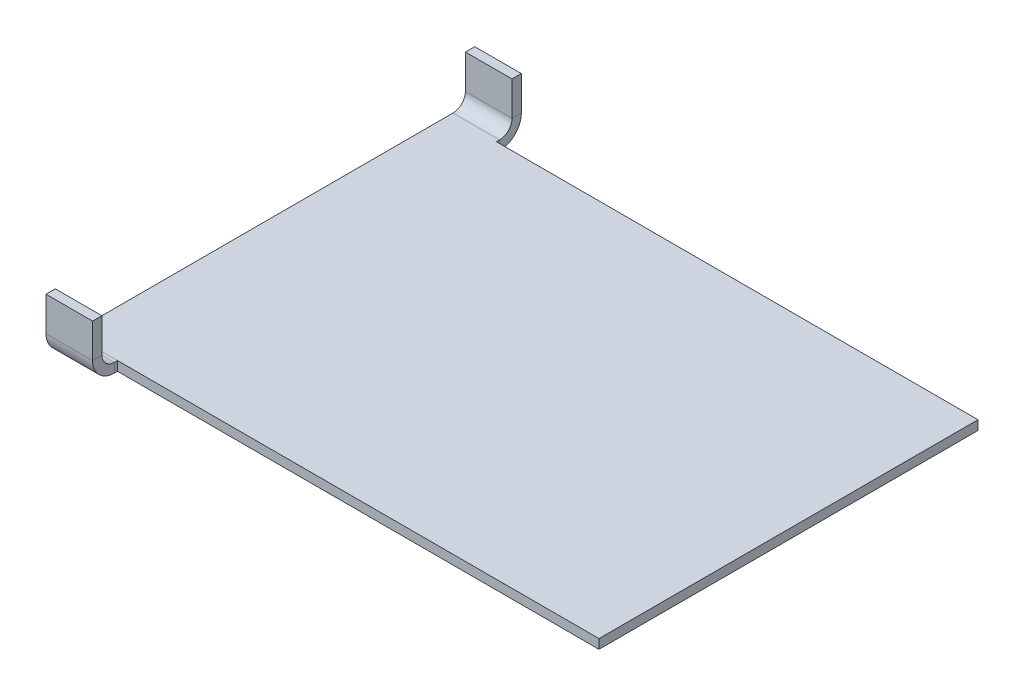
ISO-10303-21;
HEADER;
FILE_DESCRIPTION(('STEP AP214'),'2;1');
FILE_NAME('part.step','',(''),(''),'','','');
FILE_SCHEMA(('AUTOMOTIVE_DESIGN { 1 0 10303 214 1 1 1 1 }'));
ENDSEC;
DATA;
#1=APPLICATION_CONTEXT('core data for automotive mechanical design processes');
#2=APPLICATION_PROTOCOL_DEFINITION('international standard','automotive_design',2000,#1);
#3=PRODUCT_CONTEXT('',#1,'mechanical');
#4=PRODUCT('Part','Part','',(#3));
#5=PRODUCT_RELATED_PRODUCT_CATEGORY('part','',(#4));
#6=PRODUCT_DEFINITION_FORMATION('','',#4);
#7=PRODUCT_DEFINITION_CONTEXT('part definition',#1,'design');
#8=PRODUCT_DEFINITION('design','',#6,#7);
#9=PRODUCT_DEFINITION_SHAPE('','',#8);
#10=(LENGTH_UNIT() NAMED_UNIT(*) SI_UNIT(.MILLI.,.METRE.));
#11=(NAMED_UNIT(*) PLANE_ANGLE_UNIT() SI_UNIT($,.RADIAN.));
#12=(NAMED_UNIT(*) SI_UNIT($,.STERADIAN.) SOLID_ANGLE_UNIT());
#13=UNCERTAINTY_MEASURE_WITH_UNIT(LENGTH_MEASURE(1.E-05),#10,'distance_accuracy_value','');
#14=(GEOMETRIC_REPRESENTATION_CONTEXT(3) GLOBAL_UNCERTAINTY_ASSIGNED_CONTEXT((#13)) GLOBAL_UNIT_ASSIGNED_CONTEXT((#10,
#11,#12)) REPRESENTATION_CONTEXT('',''));
#15=CARTESIAN_POINT('',(0.,0.,0.));
#16=DIRECTION('',(0.,0.,1.));
#17=DIRECTION('',(1.,0.,0.));
#18=AXIS2_PLACEMENT_3D('',#15,#16,#17);
#19=CARTESIAN_POINT('',(15.,0.,123.));
#20=DIRECTION('',(1.,0.,0.));
#21=DIRECTION('',(0.,0.,-1.));
#22=AXIS2_PLACEMENT_3D('',#19,#20,#21);
#23=PLANE('',#22);
#24=DIRECTION('',(0.,-1.,0.));
#25=VECTOR('',#24,1.);
#26=CARTESIAN_POINT('',(15.,0.,123.));
#27=LINE('',#26,#25);
#28=CARTESIAN_POINT('',(15.,0.,123.));
#29=VERTEX_POINT('',#28);
#30=CARTESIAN_POINT('',(15.,-3.,123.));
#31=VERTEX_POINT('',#30);
#32=EDGE_CURVE('E12',#29,#31,#27,.T.);
#33=ORIENTED_EDGE('',*,*,#32,.F.);
#34=CARTESIAN_POINT('',(15.,4.,123.));
#35=DIRECTION('',(1.,0.,0.));
#36=DIRECTION('',(0.,0.,-1.));
#37=AXIS2_PLACEMENT_3D('',#34,#35,#36);
#38=CIRCLE('',#37,4.);
#39=CARTESIAN_POINT('',(15.,4.,127.));
#40=VERTEX_POINT('',#39);
#41=EDGE_CURVE('E193',#29,#40,#38,.F.);
#42=ORIENTED_EDGE('',*,*,#41,.T.);
#43=DIRECTION('',(0.,0.,-1.));
#44=VECTOR('',#43,1.);
#45=CARTESIAN_POINT('',(15.,4.,130.));
#46=LINE('',#45,#44);
#47=CARTESIAN_POINT('',(15.,4.,130.));
#48=VERTEX_POINT('',#47);
#49=EDGE_CURVE('E57',#48,#40,#46,.T.);
#50=ORIENTED_EDGE('',*,*,#49,.F.);
#51=CARTESIAN_POINT('',(15.,4.,123.));
#52=DIRECTION('',(-1.,0.,0.));
#53=DIRECTION('',(0.,0.,1.));
#54=AXIS2_PLACEMENT_3D('',#51,#52,#53);
#55=CIRCLE('',#54,7.);
#56=EDGE_CURVE('E146',#31,#48,#55,.T.);
#57=ORIENTED_EDGE('',*,*,#56,.F.);
#58=EDGE_LOOP('',(#33,#42,#50,#57));
#59=FACE_BOUND('',#58,.T.);
#60=ADVANCED_FACE('F49',(#59),#23,.T.);
#61=CARTESIAN_POINT('',(15.,4.,130.));
#62=DIRECTION('',(1.,0.,0.));
#63=DIRECTION('',(0.,0.,-1.));
#64=AXIS2_PLACEMENT_3D('',#61,#62,#63);
#65=PLANE('',#64);
#66=DIRECTION('',(0.,0.,1.));
#67=VECTOR('',#66,1.);
#68=CARTESIAN_POINT('',(15.,0.,122.));
#69=LINE('',#68,#67);
#70=CARTESIAN_POINT('',(15.,0.,122.));
#71=VERTEX_POINT('',#70);
#72=EDGE_CURVE('E142',#71,#29,#69,.T.);
#73=ORIENTED_EDGE('',*,*,#72,.T.);
#74=ORIENTED_EDGE('',*,*,#32,.T.);
#75=DIRECTION('',(0.,0.,1.));
#76=VECTOR('',#75,1.);
#77=CARTESIAN_POINT('',(15.,-3.,122.));
#78=LINE('',#77,#76);
#79=CARTESIAN_POINT('',(15.,-3.,122.));
#80=VERTEX_POINT('',#79);
#81=EDGE_CURVE('E127',#80,#31,#78,.T.);
#82=ORIENTED_EDGE('',*,*,#81,.F.);
#83=DIRECTION('',(0.,1.,0.));
#84=VECTOR('',#83,1.);
#85=CARTESIAN_POINT('',(15.,-3.,122.));
#86=LINE('',#85,#84);
#87=EDGE_CURVE('E136',#80,#71,#86,.T.);
#88=ORIENTED_EDGE('',*,*,#87,.T.);
#89=EDGE_LOOP('',(#73,#74,#82,#88));
#90=FACE_BOUND('',#89,.T.);
#91=ADVANCED_FACE('F144',(#90),#65,.T.);
#92=CARTESIAN_POINT('',(0.,4.,127.));
#93=DIRECTION('',(-1.,0.,0.));
#94=DIRECTION('',(0.,0.,1.));
#95=AXIS2_PLACEMENT_3D('',#92,#93,#94);
#96=PLANE('',#95);
#97=DIRECTION('',(0.,0.,1.));
#98=VECTOR('',#97,1.);
#99=CARTESIAN_POINT('',(0.,4.,127.));
#100=LINE('',#99,#98);
#101=CARTESIAN_POINT('',(0.,4.,127.));
#102=VERTEX_POINT('',#101);
#103=CARTESIAN_POINT('',(0.,4.,130.));
#104=VERTEX_POINT('',#103);
#105=EDGE_CURVE('E99',#102,#104,#100,.T.);
#106=ORIENTED_EDGE('',*,*,#105,.F.);
#107=CARTESIAN_POINT('',(0.,4.,123.));
#108=DIRECTION('',(1.,0.,0.));
#109=DIRECTION('',(0.,0.,-1.));
#110=AXIS2_PLACEMENT_3D('',#107,#108,#109);
#111=CIRCLE('',#110,4.);
#112=CARTESIAN_POINT('',(0.,0.,123.));
#113=VERTEX_POINT('',#112);
#114=EDGE_CURVE('E160',#113,#102,#111,.F.);
#115=ORIENTED_EDGE('',*,*,#114,.F.);
#116=DIRECTION('',(0.,1.,0.));
#117=VECTOR('',#116,1.);
#118=CARTESIAN_POINT('',(0.,-3.,123.));
#119=LINE('',#118,#117);
#120=CARTESIAN_POINT('',(0.,-3.,123.));
#121=VERTEX_POINT('',#120);
#122=EDGE_CURVE('E92',#121,#113,#119,.T.);
#123=ORIENTED_EDGE('',*,*,#122,.F.);
#124=CARTESIAN_POINT('',(0.,4.,123.));
#125=DIRECTION('',(-1.,0.,0.));
#126=DIRECTION('',(0.,0.,1.));
#127=AXIS2_PLACEMENT_3D('',#124,#125,#126);
#128=CIRCLE('',#127,7.);
#129=EDGE_CURVE('E169',#121,#104,#128,.T.);
#130=ORIENTED_EDGE('',*,*,#129,.T.);
#131=EDGE_LOOP('',(#106,#115,#123,#130));
#132=FACE_BOUND('',#131,.T.);
#133=ADVANCED_FACE('F207',(#132),#96,.T.);
#134=CARTESIAN_POINT('',(0.,-3.,123.));
#135=DIRECTION('',(-1.,0.,0.));
#136=DIRECTION('',(0.,0.,1.));
#137=AXIS2_PLACEMENT_3D('',#134,#135,#136);
#138=PLANE('',#137);
#139=DIRECTION('',(0.,1.,0.));
#140=VECTOR('',#139,1.);
#141=CARTESIAN_POINT('',(0.,0.,127.));
#142=LINE('',#141,#140);
#143=CARTESIAN_POINT('',(0.,15.,127.));
#144=VERTEX_POINT('',#143);
#145=EDGE_CURVE('E158',#102,#144,#142,.T.);
#146=ORIENTED_EDGE('',*,*,#145,.F.);
#147=ORIENTED_EDGE('',*,*,#105,.T.);
#148=DIRECTION('',(0.,1.,0.));
#149=VECTOR('',#148,1.);
#150=CARTESIAN_POINT('',(0.,0.,130.));
#151=LINE('',#150,#149);
#152=CARTESIAN_POINT('',(0.,15.,130.));
#153=VERTEX_POINT('',#152);
#154=EDGE_CURVE('E153',#104,#153,#151,.T.);
#155=ORIENTED_EDGE('',*,*,#154,.T.);
#156=DIRECTION('',(0.,0.,1.));
#157=VECTOR('',#156,1.);
#158=CARTESIAN_POINT('',(0.,15.,127.));
#159=LINE('',#158,#157);
#160=EDGE_CURVE('E155',#144,#153,#159,.T.);
#161=ORIENTED_EDGE('',*,*,#160,.F.);
#162=EDGE_LOOP('',(#146,#147,#155,#161));
#163=FACE_BOUND('',#162,.T.);
#164=ADVANCED_FACE('F215',(#163),#138,.T.);
#165=CARTESIAN_POINT('',(15.,0.,130.));
#166=DIRECTION('',(0.,0.,1.));
#167=DIRECTION('',(1.,0.,0.));
#168=AXIS2_PLACEMENT_3D('',#165,#166,#167);
#169=PLANE('',#168);
#170=ORIENTED_EDGE('',*,*,#154,.F.);
#171=DIRECTION('',(-1.,0.,0.));
#172=VECTOR('',#171,1.);
#173=CARTESIAN_POINT('',(15.,4.,130.));
#174=LINE('',#173,#172);
#175=EDGE_CURVE('E172',#48,#104,#174,.T.);
#176=ORIENTED_EDGE('',*,*,#175,.F.);
#177=DIRECTION('',(0.,1.,0.));
#178=VECTOR('',#177,1.);
#179=CARTESIAN_POINT('',(15.,0.,130.));
#180=LINE('',#179,#178);
#181=CARTESIAN_POINT('',(15.,15.,130.));
#182=VERTEX_POINT('',#181);
#183=EDGE_CURVE('E171',#48,#182,#180,.T.);
#184=ORIENTED_EDGE('',*,*,#183,.T.);
#185=DIRECTION('',(-1.,0.,0.));
#186=VECTOR('',#185,1.);
#187=CARTESIAN_POINT('',(15.,15.,130.));
#188=LINE('',#187,#186);
#189=EDGE_CURVE('E149',#182,#153,#188,.T.);
#190=ORIENTED_EDGE('',*,*,#189,.T.);
#191=EDGE_LOOP('',(#170,#176,#184,#190));
#192=FACE_BOUND('',#191,.T.);
#193=ADVANCED_FACE('F213',(#192),#169,.T.);
#194=CARTESIAN_POINT('',(15.,4.,123.));
#195=DIRECTION('',(-1.,0.,0.));
#196=DIRECTION('',(0.,0.,1.));
#197=AXIS2_PLACEMENT_3D('',#194,#195,#196);
#198=CYLINDRICAL_SURFACE('',#197,7.);
#199=ORIENTED_EDGE('',*,*,#129,.F.);
#200=DIRECTION('',(-1.,0.,0.));
#201=VECTOR('',#200,1.);
#202=CARTESIAN_POINT('',(15.,-3.,123.));
#203=LINE('',#202,#201);
#204=EDGE_CURVE('E132',#31,#121,#203,.T.);
#205=ORIENTED_EDGE('',*,*,#204,.F.);
#206=ORIENTED_EDGE('',*,*,#56,.T.);
#207=ORIENTED_EDGE('',*,*,#175,.T.);
#208=EDGE_LOOP('',(#199,#205,#206,#207));
#209=FACE_BOUND('',#208,.T.);
#210=ADVANCED_FACE('F210',(#209),#198,.T.);
#211=CARTESIAN_POINT('',(15.,-3.,122.));
#212=DIRECTION('',(0.,-1.,0.));
#213=DIRECTION('',(0.,0.,-1.));
#214=AXIS2_PLACEMENT_3D('',#211,#212,#213);
#215=PLANE('',#214);
#216=DIRECTION('',(0.,0.,1.));
#217=VECTOR('',#216,1.);
#218=CARTESIAN_POINT('',(0.,-3.,122.));
#219=LINE('',#218,#217);
#220=CARTESIAN_POINT('',(0.,-3.,122.));
#221=VERTEX_POINT('',#220);
#222=EDGE_CURVE('E129',#221,#121,#219,.T.);
#223=ORIENTED_EDGE('',*,*,#222,.F.);
#224=DIRECTION('',(-1.,0.,0.));
#225=VECTOR('',#224,1.);
#226=CARTESIAN_POINT('',(15.,-3.,122.));
#227=LINE('',#226,#225);
#228=EDGE_CURVE('E123',#80,#221,#227,.T.);
#229=ORIENTED_EDGE('',*,*,#228,.F.);
#230=ORIENTED_EDGE('',*,*,#81,.T.);
#231=ORIENTED_EDGE('',*,*,#204,.T.);
#232=EDGE_LOOP('',(#223,#229,#230,#231));
#233=FACE_BOUND('',#232,.T.);
#234=ADVANCED_FACE('F125',(#233),#215,.T.);
#235=CARTESIAN_POINT('',(15.,-3.,122.));
#236=DIRECTION('',(0.,0.,1.));
#237=DIRECTION('',(1.,0.,0.));
#238=AXIS2_PLACEMENT_3D('',#235,#236,#237);
#239=PLANE('',#238);
#240=DIRECTION('',(0.,1.,0.));
#241=VECTOR('',#240,1.);
#242=CARTESIAN_POINT('',(0.,-3.,122.));
#243=LINE('',#242,#241);
#244=CARTESIAN_POINT('',(0.,0.,122.));
#245=VERTEX_POINT('',#244);
#246=EDGE_CURVE('E166',#221,#245,#243,.T.);
#247=ORIENTED_EDGE('',*,*,#246,.T.);
#248=DIRECTION('',(-1.,0.,0.));
#249=VECTOR('',#248,1.);
#250=CARTESIAN_POINT('',(15.,0.,122.));
#251=LINE('',#250,#249);
#252=EDGE_CURVE('E133',#71,#245,#251,.T.);
#253=ORIENTED_EDGE('',*,*,#252,.F.);
#254=ORIENTED_EDGE('',*,*,#87,.F.);
#255=ORIENTED_EDGE('',*,*,#228,.T.);
#256=EDGE_LOOP('',(#247,#253,#254,#255));
#257=FACE_BOUND('',#256,.T.);
#258=ADVANCED_FACE('F137',(#257),#239,.F.);
#259=CARTESIAN_POINT('',(15.,0.,122.));
#260=DIRECTION('',(0.,-1.,0.));
#261=DIRECTION('',(0.,0.,-1.));
#262=AXIS2_PLACEMENT_3D('',#259,#260,#261);
#263=PLANE('',#262);
#264=DIRECTION('',(0.,0.,1.));
#265=VECTOR('',#264,1.);
#266=CARTESIAN_POINT('',(0.,0.,122.));
#267=LINE('',#266,#265);
#268=EDGE_CURVE('E163',#245,#113,#267,.T.);
#269=ORIENTED_EDGE('',*,*,#268,.T.);
#270=DIRECTION('',(-1.,0.,0.));
#271=VECTOR('',#270,1.);
#272=CARTESIAN_POINT('',(15.,0.,123.));
#273=LINE('',#272,#271);
#274=EDGE_CURVE('E176',#29,#113,#273,.T.);
#275=ORIENTED_EDGE('',*,*,#274,.F.);
#276=ORIENTED_EDGE('',*,*,#72,.F.);
#277=ORIENTED_EDGE('',*,*,#252,.T.);
#278=EDGE_LOOP('',(#269,#275,#276,#277));
#279=FACE_BOUND('',#278,.T.);
#280=ADVANCED_FACE('F205',(#279),#263,.F.);
#281=CARTESIAN_POINT('',(15.,4.,123.));
#282=DIRECTION('',(-1.,0.,0.));
#283=DIRECTION('',(0.,0.,1.));
#284=AXIS2_PLACEMENT_3D('',#281,#282,#283);
#285=CYLINDRICAL_SURFACE('',#284,4.);
#286=ORIENTED_EDGE('',*,*,#114,.T.);
#287=DIRECTION('',(-1.,0.,0.));
#288=VECTOR('',#287,1.);
#289=CARTESIAN_POINT('',(15.,4.,127.));
#290=LINE('',#289,#288);
#291=EDGE_CURVE('E179',#40,#102,#290,.T.);
#292=ORIENTED_EDGE('',*,*,#291,.F.);
#293=ORIENTED_EDGE('',*,*,#41,.F.);
#294=ORIENTED_EDGE('',*,*,#274,.T.);
#295=EDGE_LOOP('',(#286,#292,#293,#294));
#296=FACE_BOUND('',#295,.T.);
#297=ADVANCED_FACE('F197',(#296),#285,.F.);
#298=CARTESIAN_POINT('',(15.,0.,127.));
#299=DIRECTION('',(0.,0.,1.));
#300=DIRECTION('',(1.,0.,0.));
#301=AXIS2_PLACEMENT_3D('',#298,#299,#300);
#302=PLANE('',#301);
#303=ORIENTED_EDGE('',*,*,#145,.T.);
#304=DIRECTION('',(-1.,0.,0.));
#305=VECTOR('',#304,1.);
#306=CARTESIAN_POINT('',(15.,15.,127.));
#307=LINE('',#306,#305);
#308=CARTESIAN_POINT('',(15.,15.,127.));
#309=VERTEX_POINT('',#308);
#310=EDGE_CURVE('E182',#309,#144,#307,.T.);
#311=ORIENTED_EDGE('',*,*,#310,.F.);
#312=DIRECTION('',(0.,1.,0.));
#313=VECTOR('',#312,1.);
#314=CARTESIAN_POINT('',(15.,0.,127.));
#315=LINE('',#314,#313);
#316=EDGE_CURVE('E189',#40,#309,#315,.T.);
#317=ORIENTED_EDGE('',*,*,#316,.F.);
#318=ORIENTED_EDGE('',*,*,#291,.T.);
#319=EDGE_LOOP('',(#303,#311,#317,#318));
#320=FACE_BOUND('',#319,.T.);
#321=ADVANCED_FACE('F199',(#320),#302,.F.);
#322=CARTESIAN_POINT('',(15.,15.,127.));
#323=DIRECTION('',(0.,-1.,0.));
#324=DIRECTION('',(0.,0.,-1.));
#325=AXIS2_PLACEMENT_3D('',#322,#323,#324);
#326=PLANE('',#325);
#327=ORIENTED_EDGE('',*,*,#160,.T.);
#328=ORIENTED_EDGE('',*,*,#189,.F.);
#329=DIRECTION('',(0.,0.,1.));
#330=VECTOR('',#329,1.);
#331=CARTESIAN_POINT('',(15.,15.,127.));
#332=LINE('',#331,#330);
#333=EDGE_CURVE('E108',#309,#182,#332,.T.);
#334=ORIENTED_EDGE('',*,*,#333,.F.);
#335=ORIENTED_EDGE('',*,*,#310,.T.);
#336=EDGE_LOOP('',(#327,#328,#334,#335));
#337=FACE_BOUND('',#336,.T.);
#338=ADVANCED_FACE('F217',(#337),#326,.F.);
#339=CARTESIAN_POINT('',(15.,4.,123.));
#340=DIRECTION('',(1.,0.,0.));
#341=DIRECTION('',(0.,0.,-1.));
#342=AXIS2_PLACEMENT_3D('',#339,#340,#341);
#343=PLANE('',#342);
#344=ORIENTED_EDGE('',*,*,#183,.F.);
#345=ORIENTED_EDGE('',*,*,#49,.T.);
#346=ORIENTED_EDGE('',*,*,#316,.T.);
#347=ORIENTED_EDGE('',*,*,#333,.T.);
#348=EDGE_LOOP('',(#344,#345,#346,#347));
#349=FACE_BOUND('',#348,.T.);
#350=ADVANCED_FACE('F187',(#349),#343,.T.);
#351=CARTESIAN_POINT('',(0.,4.,123.));
#352=DIRECTION('',(1.,0.,0.));
#353=DIRECTION('',(0.,0.,-1.));
#354=AXIS2_PLACEMENT_3D('',#351,#352,#353);
#355=PLANE('',#354);
#356=ORIENTED_EDGE('',*,*,#222,.T.);
#357=ORIENTED_EDGE('',*,*,#122,.T.);
#358=ORIENTED_EDGE('',*,*,#268,.F.);
#359=ORIENTED_EDGE('',*,*,#246,.F.);
#360=EDGE_LOOP('',(#356,#357,#358,#359));
#361=FACE_BOUND('',#360,.T.);
#362=ADVANCED_FACE('F224',(#361),#355,.F.);
#363=CLOSED_SHELL('',(#60,#91,#133,#164,#193,#210,#234,#258,#280,#297,#321,#338,#350,#362));
#364=MANIFOLD_SOLID_BREP('B2',#363);
#365=CARTESIAN_POINT('',(15.,4.,-5.));
#366=DIRECTION('',(1.,0.,0.));
#367=DIRECTION('',(0.,0.,-1.));
#368=AXIS2_PLACEMENT_3D('',#365,#366,#367);
#369=PLANE('',#368);
#370=DIRECTION('',(0.,0.,-1.));
#371=VECTOR('',#370,1.);
#372=CARTESIAN_POINT('',(15.,4.,-5.));
#373=LINE('',#372,#371);
#374=CARTESIAN_POINT('',(15.,4.,-5.));
#375=VERTEX_POINT('',#374);
#376=CARTESIAN_POINT('',(15.,4.,-8.));
#377=VERTEX_POINT('',#376);
#378=EDGE_CURVE('E47',#375,#377,#373,.T.);
#379=ORIENTED_EDGE('',*,*,#378,.F.);
#380=CARTESIAN_POINT('',(15.,4.,-1.));
#381=DIRECTION('',(-1.,0.,0.));
#382=DIRECTION('',(0.,0.,1.));
#383=AXIS2_PLACEMENT_3D('',#380,#381,#382);
#384=CIRCLE('',#383,4.);
#385=CARTESIAN_POINT('',(15.,0.,-1.));
#386=VERTEX_POINT('',#385);
#387=EDGE_CURVE('E486',#386,#375,#384,.F.);
#388=ORIENTED_EDGE('',*,*,#387,.F.);
#389=DIRECTION('',(0.,1.,0.));
#390=VECTOR('',#389,1.);
#391=CARTESIAN_POINT('',(15.,-3.,-0.999999999999999));
#392=LINE('',#391,#390);
#393=CARTESIAN_POINT('',(15.,-3.,-0.999999999999999));
#394=VERTEX_POINT('',#393);
#395=EDGE_CURVE('E369',#394,#386,#392,.T.);
#396=ORIENTED_EDGE('',*,*,#395,.F.);
#397=CARTESIAN_POINT('',(15.,4.,-1.));
#398=DIRECTION('',(1.,0.,0.));
#399=DIRECTION('',(0.,0.,-1.));
#400=AXIS2_PLACEMENT_3D('',#397,#398,#399);
#401=CIRCLE('',#400,7.);
#402=EDGE_CURVE('E439',#394,#377,#401,.T.);
#403=ORIENTED_EDGE('',*,*,#402,.T.);
#404=EDGE_LOOP('',(#379,#388,#396,#403));
#405=FACE_BOUND('',#404,.T.);
#406=ADVANCED_FACE('F361',(#405),#369,.T.);
#407=CARTESIAN_POINT('',(15.,-3.,-0.999999999999999));
#408=DIRECTION('',(1.,0.,0.));
#409=DIRECTION('',(0.,0.,-1.));
#410=AXIS2_PLACEMENT_3D('',#407,#408,#409);
#411=PLANE('',#410);
#412=DIRECTION('',(0.,1.,0.));
#413=VECTOR('',#412,1.);
#414=CARTESIAN_POINT('',(15.,0.,-5.));
#415=LINE('',#414,#413);
#416=CARTESIAN_POINT('',(15.,15.,-5.));
#417=VERTEX_POINT('',#416);
#418=EDGE_CURVE('E483',#375,#417,#415,.T.);
#419=ORIENTED_EDGE('',*,*,#418,.F.);
#420=ORIENTED_EDGE('',*,*,#378,.T.);
#421=DIRECTION('',(0.,1.,0.));
#422=VECTOR('',#421,1.);
#423=CARTESIAN_POINT('',(15.,0.,-8.));
#424=LINE('',#423,#422);
#425=CARTESIAN_POINT('',(15.,15.,-8.));
#426=VERTEX_POINT('',#425);
#427=EDGE_CURVE('E412',#377,#426,#424,.T.);
#428=ORIENTED_EDGE('',*,*,#427,.T.);
#429=DIRECTION('',(0.,0.,-1.));
#430=VECTOR('',#429,1.);
#431=CARTESIAN_POINT('',(15.,15.,-5.));
#432=LINE('',#431,#430);
#433=EDGE_CURVE('E479',#417,#426,#432,.T.);
#434=ORIENTED_EDGE('',*,*,#433,.F.);
#435=EDGE_LOOP('',(#419,#420,#428,#434));
#436=FACE_BOUND('',#435,.T.);
#437=ADVANCED_FACE('F557',(#436),#411,.T.);
#438=CARTESIAN_POINT('',(0.,0.,-1.));
#439=DIRECTION('',(-1.,0.,0.));
#440=DIRECTION('',(0.,0.,1.));
#441=AXIS2_PLACEMENT_3D('',#438,#439,#440);
#442=PLANE('',#441);
#443=DIRECTION('',(0.,-1.,0.));
#444=VECTOR('',#443,1.);
#445=CARTESIAN_POINT('',(0.,0.,-1.));
#446=LINE('',#445,#444);
#447=CARTESIAN_POINT('',(0.,0.,-1.));
#448=VERTEX_POINT('',#447);
#449=CARTESIAN_POINT('',(0.,-3.,-0.999999999999999));
#450=VERTEX_POINT('',#449);
#451=EDGE_CURVE('E399',#448,#450,#446,.T.);
#452=ORIENTED_EDGE('',*,*,#451,.F.);
#453=CARTESIAN_POINT('',(0.,4.,-1.));
#454=DIRECTION('',(-1.,0.,0.));
#455=DIRECTION('',(0.,0.,1.));
#456=AXIS2_PLACEMENT_3D('',#453,#454,#455);
#457=CIRCLE('',#456,4.);
#458=CARTESIAN_POINT('',(0.,4.,-5.));
#459=VERTEX_POINT('',#458);
#460=EDGE_CURVE('E500',#448,#459,#457,.F.);
#461=ORIENTED_EDGE('',*,*,#460,.T.);
#462=DIRECTION('',(0.,0.,1.));
#463=VECTOR('',#462,1.);
#464=CARTESIAN_POINT('',(0.,4.,-8.));
#465=LINE('',#464,#463);
#466=CARTESIAN_POINT('',(0.,4.,-8.));
#467=VERTEX_POINT('',#466);
#468=EDGE_CURVE('E406',#467,#459,#465,.T.);
#469=ORIENTED_EDGE('',*,*,#468,.F.);
#470=CARTESIAN_POINT('',(0.,4.,-1.));
#471=DIRECTION('',(1.,0.,0.));
#472=DIRECTION('',(0.,0.,-1.));
#473=AXIS2_PLACEMENT_3D('',#470,#471,#472);
#474=CIRCLE('',#473,7.);
#475=EDGE_CURVE('E480',#450,#467,#474,.T.);
#476=ORIENTED_EDGE('',*,*,#475,.F.);
#477=EDGE_LOOP('',(#452,#461,#469,#476));
#478=FACE_BOUND('',#477,.T.);
#479=ADVANCED_FACE('F555',(#478),#442,.T.);
#480=CARTESIAN_POINT('',(0.,4.,-8.));
#481=DIRECTION('',(-1.,0.,0.));
#482=DIRECTION('',(0.,0.,1.));
#483=AXIS2_PLACEMENT_3D('',#480,#481,#482);
#484=PLANE('',#483);
#485=DIRECTION('',(0.,0.,-1.));
#486=VECTOR('',#485,1.);
#487=CARTESIAN_POINT('',(0.,0.,0.));
#488=LINE('',#487,#486);
#489=CARTESIAN_POINT('',(0.,0.,122.));
#490=VERTEX_POINT('',#489);
#491=EDGE_CURVE('E502',#490,#448,#488,.T.);
#492=ORIENTED_EDGE('',*,*,#491,.T.);
#493=ORIENTED_EDGE('',*,*,#451,.T.);
#494=DIRECTION('',(0.,0.,-1.));
#495=VECTOR('',#494,1.);
#496=CARTESIAN_POINT('',(0.,-3.,0.));
#497=LINE('',#496,#495);
#498=CARTESIAN_POINT('',(0.,-3.,122.));
#499=VERTEX_POINT('',#498);
#500=EDGE_CURVE('E504',#499,#450,#497,.T.);
#501=ORIENTED_EDGE('',*,*,#500,.F.);
#502=DIRECTION('',(0.,1.,0.));
#503=VECTOR('',#502,1.);
#504=CARTESIAN_POINT('',(0.,-3.,122.));
#505=LINE('',#504,#503);
#506=EDGE_CURVE('E456',#499,#490,#505,.T.);
#507=ORIENTED_EDGE('',*,*,#506,.T.);
#508=EDGE_LOOP('',(#492,#493,#501,#507));
#509=FACE_BOUND('',#508,.T.);
#510=ADVANCED_FACE('F551',(#509),#484,.T.);
#511=CARTESIAN_POINT('',(15.,0.,-8.));
#512=DIRECTION('',(0.,0.,1.));
#513=DIRECTION('',(1.,0.,0.));
#514=AXIS2_PLACEMENT_3D('',#511,#512,#513);
#515=PLANE('',#514);
#516=DIRECTION('',(0.,1.,0.));
#517=VECTOR('',#516,1.);
#518=CARTESIAN_POINT('',(0.,0.,-8.));
#519=LINE('',#518,#517);
#520=CARTESIAN_POINT('',(0.,15.,-8.));
#521=VERTEX_POINT('',#520);
#522=EDGE_CURVE('E475',#467,#521,#519,.T.);
#523=ORIENTED_EDGE('',*,*,#522,.T.);
#524=DIRECTION('',(-1.,0.,0.));
#525=VECTOR('',#524,1.);
#526=CARTESIAN_POINT('',(15.,15.,-8.));
#527=LINE('',#526,#525);
#528=EDGE_CURVE('E518',#426,#521,#527,.T.);
#529=ORIENTED_EDGE('',*,*,#528,.F.);
#530=ORIENTED_EDGE('',*,*,#427,.F.);
#531=DIRECTION('',(-1.,0.,0.));
#532=VECTOR('',#531,1.);
#533=CARTESIAN_POINT('',(15.,4.,-8.));
#534=LINE('',#533,#532);
#535=EDGE_CURVE('E491',#377,#467,#534,.T.);
#536=ORIENTED_EDGE('',*,*,#535,.T.);
#537=EDGE_LOOP('',(#523,#529,#530,#536));
#538=FACE_BOUND('',#537,.T.);
#539=ADVANCED_FACE('F563',(#538),#515,.F.);
#540=CARTESIAN_POINT('',(15.,15.,-5.));
#541=DIRECTION('',(0.,1.,0.));
#542=DIRECTION('',(0.,0.,1.));
#543=AXIS2_PLACEMENT_3D('',#540,#541,#542);
#544=PLANE('',#543);
#545=DIRECTION('',(0.,0.,-1.));
#546=VECTOR('',#545,1.);
#547=CARTESIAN_POINT('',(0.,15.,-5.));
#548=LINE('',#547,#546);
#549=CARTESIAN_POINT('',(0.,15.,-5.));
#550=VERTEX_POINT('',#549);
#551=EDGE_CURVE('E494',#550,#521,#548,.T.);
#552=ORIENTED_EDGE('',*,*,#551,.F.);
#553=DIRECTION('',(-1.,0.,0.));
#554=VECTOR('',#553,1.);
#555=CARTESIAN_POINT('',(15.,15.,-5.));
#556=LINE('',#555,#554);
#557=EDGE_CURVE('E516',#417,#550,#556,.T.);
#558=ORIENTED_EDGE('',*,*,#557,.F.);
#559=ORIENTED_EDGE('',*,*,#433,.T.);
#560=ORIENTED_EDGE('',*,*,#528,.T.);
#561=EDGE_LOOP('',(#552,#558,#559,#560));
#562=FACE_BOUND('',#561,.T.);
#563=ADVANCED_FACE('F588',(#562),#544,.T.);
#564=CARTESIAN_POINT('',(15.,0.,-5.));
#565=DIRECTION('',(0.,0.,1.));
#566=DIRECTION('',(1.,0.,0.));
#567=AXIS2_PLACEMENT_3D('',#564,#565,#566);
#568=PLANE('',#567);
#569=DIRECTION('',(0.,1.,0.));
#570=VECTOR('',#569,1.);
#571=CARTESIAN_POINT('',(0.,0.,-5.));
#572=LINE('',#571,#570);
#573=EDGE_CURVE('E497',#459,#550,#572,.T.);
#574=ORIENTED_EDGE('',*,*,#573,.F.);
#575=DIRECTION('',(-1.,0.,0.));
#576=VECTOR('',#575,1.);
#577=CARTESIAN_POINT('',(15.,4.,-5.));
#578=LINE('',#577,#576);
#579=EDGE_CURVE('E513',#375,#459,#578,.T.);
#580=ORIENTED_EDGE('',*,*,#579,.F.);
#581=ORIENTED_EDGE('',*,*,#418,.T.);
#582=ORIENTED_EDGE('',*,*,#557,.T.);
#583=EDGE_LOOP('',(#574,#580,#581,#582));
#584=FACE_BOUND('',#583,.T.);
#585=ADVANCED_FACE('F599',(#584),#568,.T.);
#586=CARTESIAN_POINT('',(15.,4.,-1.));
#587=DIRECTION('',(-1.,0.,0.));
#588=DIRECTION('',(0.,0.,1.));
#589=AXIS2_PLACEMENT_3D('',#586,#587,#588);
#590=CYLINDRICAL_SURFACE('',#589,4.);
#591=ORIENTED_EDGE('',*,*,#460,.F.);
#592=DIRECTION('',(-1.,0.,0.));
#593=VECTOR('',#592,1.);
#594=CARTESIAN_POINT('',(15.,0.,-1.));
#595=LINE('',#594,#593);
#596=EDGE_CURVE('E510',#386,#448,#595,.T.);
#597=ORIENTED_EDGE('',*,*,#596,.F.);
#598=ORIENTED_EDGE('',*,*,#387,.T.);
#599=ORIENTED_EDGE('',*,*,#579,.T.);
#600=EDGE_LOOP('',(#591,#597,#598,#599));
#601=FACE_BOUND('',#600,.T.);
#602=ADVANCED_FACE('F526',(#601),#590,.F.);
#603=CARTESIAN_POINT('',(15.,0.,0.));
#604=DIRECTION('',(0.,1.,0.));
#605=DIRECTION('',(0.,0.,1.));
#606=AXIS2_PLACEMENT_3D('',#603,#604,#605);
#607=PLANE('',#606);
#608=ORIENTED_EDGE('',*,*,#491,.F.);
#609=DIRECTION('',(1.,0.,0.));
#610=VECTOR('',#609,1.);
#611=CARTESIAN_POINT('',(0.,0.,122.));
#612=LINE('',#611,#610);
#613=CARTESIAN_POINT('',(170.,0.,122.));
#614=VERTEX_POINT('',#613);
#615=EDGE_CURVE('E466',#490,#614,#612,.T.);
#616=ORIENTED_EDGE('',*,*,#615,.T.);
#617=DIRECTION('',(0.,0.,-1.));
#618=VECTOR('',#617,1.);
#619=CARTESIAN_POINT('',(170.,0.,0.));
#620=LINE('',#619,#618);
#621=CARTESIAN_POINT('',(170.,0.,0.));
#622=VERTEX_POINT('',#621);
#623=EDGE_CURVE('E469',#614,#622,#620,.T.);
#624=ORIENTED_EDGE('',*,*,#623,.T.);
#625=DIRECTION('',(-1.,0.,0.));
#626=VECTOR('',#625,1.);
#627=CARTESIAN_POINT('',(0.,0.,0.));
#628=LINE('',#627,#626);
#629=CARTESIAN_POINT('',(15.,0.,0.));
#630=VERTEX_POINT('',#629);
#631=EDGE_CURVE('E472',#622,#630,#628,.T.);
#632=ORIENTED_EDGE('',*,*,#631,.T.);
#633=DIRECTION('',(0.,0.,-1.));
#634=VECTOR('',#633,1.);
#635=CARTESIAN_POINT('',(15.,0.,0.));
#636=LINE('',#635,#634);
#637=EDGE_CURVE('E446',#630,#386,#636,.T.);
#638=ORIENTED_EDGE('',*,*,#637,.T.);
#639=ORIENTED_EDGE('',*,*,#596,.T.);
#640=EDGE_LOOP('',(#608,#616,#624,#632,#638,#639));
#641=FACE_BOUND('',#640,.T.);
#642=ADVANCED_FACE('F530',(#641),#607,.T.);
#643=CARTESIAN_POINT('',(15.,-3.,0.));
#644=DIRECTION('',(0.,1.,0.));
#645=DIRECTION('',(0.,0.,1.));
#646=AXIS2_PLACEMENT_3D('',#643,#644,#645);
#647=PLANE('',#646);
#648=ORIENTED_EDGE('',*,*,#500,.T.);
#649=DIRECTION('',(-1.,0.,0.));
#650=VECTOR('',#649,1.);
#651=CARTESIAN_POINT('',(15.,-3.,-0.999999999999999));
#652=LINE('',#651,#650);
#653=EDGE_CURVE('E436',#394,#450,#652,.T.);
#654=ORIENTED_EDGE('',*,*,#653,.F.);
#655=DIRECTION('',(0.,0.,-1.));
#656=VECTOR('',#655,1.);
#657=CARTESIAN_POINT('',(15.,-3.,0.));
#658=LINE('',#657,#656);
#659=CARTESIAN_POINT('',(15.,-3.,0.));
#660=VERTEX_POINT('',#659);
#661=EDGE_CURVE('E428',#660,#394,#658,.T.);
#662=ORIENTED_EDGE('',*,*,#661,.F.);
#663=DIRECTION('',(-1.,0.,0.));
#664=VECTOR('',#663,1.);
#665=CARTESIAN_POINT('',(0.,-3.,0.));
#666=LINE('',#665,#664);
#667=CARTESIAN_POINT('',(170.,-3.,0.));
#668=VERTEX_POINT('',#667);
#669=EDGE_CURVE('E434',#668,#660,#666,.T.);
#670=ORIENTED_EDGE('',*,*,#669,.F.);
#671=DIRECTION('',(0.,0.,-1.));
#672=VECTOR('',#671,1.);
#673=CARTESIAN_POINT('',(170.,-3.,0.));
#674=LINE('',#673,#672);
#675=CARTESIAN_POINT('',(170.,-3.,122.));
#676=VERTEX_POINT('',#675);
#677=EDGE_CURVE('E457',#676,#668,#674,.T.);
#678=ORIENTED_EDGE('',*,*,#677,.F.);
#679=DIRECTION('',(1.,0.,0.));
#680=VECTOR('',#679,1.);
#681=CARTESIAN_POINT('',(0.,-3.,122.));
#682=LINE('',#681,#680);
#683=EDGE_CURVE('E462',#499,#676,#682,.T.);
#684=ORIENTED_EDGE('',*,*,#683,.F.);
#685=EDGE_LOOP('',(#648,#654,#662,#670,#678,#684));
#686=FACE_BOUND('',#685,.T.);
#687=ADVANCED_FACE('F430',(#686),#647,.F.);
#688=CARTESIAN_POINT('',(15.,4.,-1.));
#689=DIRECTION('',(-1.,0.,0.));
#690=DIRECTION('',(0.,0.,1.));
#691=AXIS2_PLACEMENT_3D('',#688,#689,#690);
#692=CYLINDRICAL_SURFACE('',#691,7.);
#693=ORIENTED_EDGE('',*,*,#475,.T.);
#694=ORIENTED_EDGE('',*,*,#535,.F.);
#695=ORIENTED_EDGE('',*,*,#402,.F.);
#696=ORIENTED_EDGE('',*,*,#653,.T.);
#697=EDGE_LOOP('',(#693,#694,#695,#696));
#698=FACE_BOUND('',#697,.T.);
#699=ADVANCED_FACE('F553',(#698),#692,.T.);
#700=CARTESIAN_POINT('',(15.,4.,-1.));
#701=DIRECTION('',(-1.,0.,0.));
#702=DIRECTION('',(0.,0.,1.));
#703=AXIS2_PLACEMENT_3D('',#700,#701,#702);
#704=PLANE('',#703);
#705=ORIENTED_EDGE('',*,*,#661,.T.);
#706=ORIENTED_EDGE('',*,*,#395,.T.);
#707=ORIENTED_EDGE('',*,*,#637,.F.);
#708=DIRECTION('',(0.,1.,0.));
#709=VECTOR('',#708,1.);
#710=CARTESIAN_POINT('',(15.,-3.,0.));
#711=LINE('',#710,#709);
#712=EDGE_CURVE('E440',#660,#630,#711,.T.);
#713=ORIENTED_EDGE('',*,*,#712,.F.);
#714=EDGE_LOOP('',(#705,#706,#707,#713));
#715=FACE_BOUND('',#714,.T.);
#716=ADVANCED_FACE('F444',(#715),#704,.F.);
#717=CARTESIAN_POINT('',(0.,4.,-1.));
#718=DIRECTION('',(-1.,0.,0.));
#719=DIRECTION('',(0.,0.,1.));
#720=AXIS2_PLACEMENT_3D('',#717,#718,#719);
#721=PLANE('',#720);
#722=ORIENTED_EDGE('',*,*,#522,.F.);
#723=ORIENTED_EDGE('',*,*,#468,.T.);
#724=ORIENTED_EDGE('',*,*,#573,.T.);
#725=ORIENTED_EDGE('',*,*,#551,.T.);
#726=EDGE_LOOP('',(#722,#723,#724,#725));
#727=FACE_BOUND('',#726,.T.);
#728=ADVANCED_FACE('F640',(#727),#721,.T.);
#729=CARTESIAN_POINT('',(0.,-3.,0.));
#730=DIRECTION('',(0.,0.,-1.));
#731=DIRECTION('',(-1.,0.,0.));
#732=AXIS2_PLACEMENT_3D('',#729,#730,#731);
#733=PLANE('',#732);
#734=ORIENTED_EDGE('',*,*,#669,.T.);
#735=ORIENTED_EDGE('',*,*,#712,.T.);
#736=ORIENTED_EDGE('',*,*,#631,.F.);
#737=DIRECTION('',(0.,1.,0.));
#738=VECTOR('',#737,1.);
#739=CARTESIAN_POINT('',(170.,-3.,0.));
#740=LINE('',#739,#738);
#741=EDGE_CURVE('E454',#668,#622,#740,.T.);
#742=ORIENTED_EDGE('',*,*,#741,.F.);
#743=EDGE_LOOP('',(#734,#735,#736,#742));
#744=FACE_BOUND('',#743,.T.);
#745=ADVANCED_FACE('F452',(#744),#733,.T.);
#746=CARTESIAN_POINT('',(170.,-3.,0.));
#747=DIRECTION('',(1.,0.,0.));
#748=DIRECTION('',(0.,0.,-1.));
#749=AXIS2_PLACEMENT_3D('',#746,#747,#748);
#750=PLANE('',#749);
#751=ORIENTED_EDGE('',*,*,#623,.F.);
#752=DIRECTION('',(0.,1.,0.));
#753=VECTOR('',#752,1.);
#754=CARTESIAN_POINT('',(170.,-3.,122.));
#755=LINE('',#754,#753);
#756=EDGE_CURVE('E460',#676,#614,#755,.T.);
#757=ORIENTED_EDGE('',*,*,#756,.F.);
#758=ORIENTED_EDGE('',*,*,#677,.T.);
#759=ORIENTED_EDGE('',*,*,#741,.T.);
#760=EDGE_LOOP('',(#751,#757,#758,#759));
#761=FACE_BOUND('',#760,.T.);
#762=ADVANCED_FACE('F544',(#761),#750,.T.);
#763=CARTESIAN_POINT('',(0.,-3.,122.));
#764=DIRECTION('',(0.,0.,1.));
#765=DIRECTION('',(1.,0.,0.));
#766=AXIS2_PLACEMENT_3D('',#763,#764,#765);
#767=PLANE('',#766);
#768=ORIENTED_EDGE('',*,*,#615,.F.);
#769=ORIENTED_EDGE('',*,*,#506,.F.);
#770=ORIENTED_EDGE('',*,*,#683,.T.);
#771=ORIENTED_EDGE('',*,*,#756,.T.);
#772=EDGE_LOOP('',(#768,#769,#770,#771));
#773=FACE_BOUND('',#772,.T.);
#774=ADVANCED_FACE('F550',(#773),#767,.T.);
#775=CLOSED_SHELL('',(#406,#437,#479,#510,#539,#563,#585,#602,#642,#687,#699,#716,#728,#745,
#762,#774));
#776=MANIFOLD_SOLID_BREP('B6',#775);
#777=ADVANCED_BREP_SHAPE_REPRESENTATION('',(#18,#364,#776),#14);
#778=SHAPE_DEFINITION_REPRESENTATION(#9,#777);
ENDSEC;
END-ISO-10303-21;
